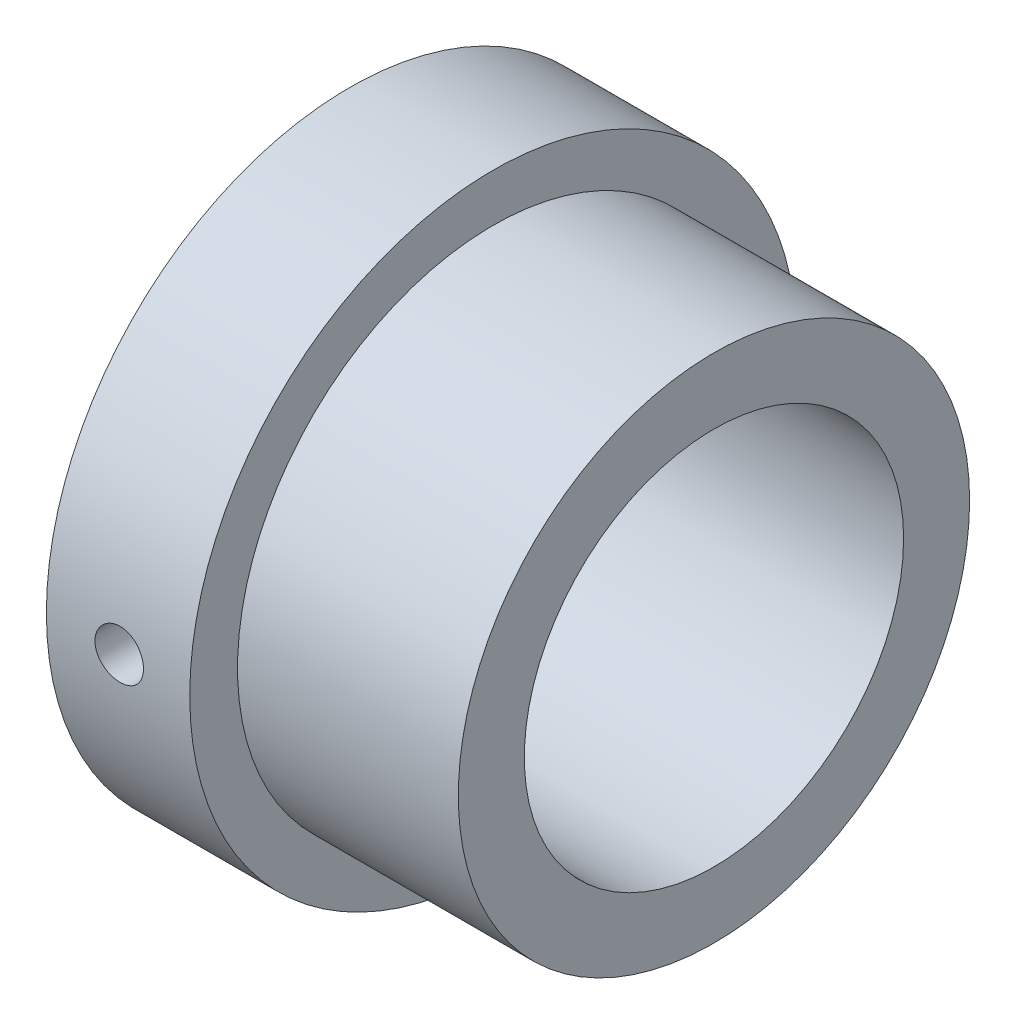
ISO-10303-21;
HEADER;
FILE_DESCRIPTION(('STEP AP214'),'2;1');
FILE_NAME('part.step','',(''),(''),'','','');
FILE_SCHEMA(('AUTOMOTIVE_DESIGN { 1 0 10303 214 1 1 1 1 }'));
ENDSEC;
DATA;
#1=APPLICATION_CONTEXT('core data for automotive mechanical design processes');
#2=APPLICATION_PROTOCOL_DEFINITION('international standard','automotive_design',2000,#1);
#3=PRODUCT_CONTEXT('',#1,'mechanical');
#4=PRODUCT('Part','Part','',(#3));
#5=PRODUCT_RELATED_PRODUCT_CATEGORY('part','',(#4));
#6=PRODUCT_DEFINITION_FORMATION('','',#4);
#7=PRODUCT_DEFINITION_CONTEXT('part definition',#1,'design');
#8=PRODUCT_DEFINITION('design','',#6,#7);
#9=PRODUCT_DEFINITION_SHAPE('','',#8);
#10=(LENGTH_UNIT() NAMED_UNIT(*) SI_UNIT(.MILLI.,.METRE.));
#11=(NAMED_UNIT(*) PLANE_ANGLE_UNIT() SI_UNIT($,.RADIAN.));
#12=(NAMED_UNIT(*) SI_UNIT($,.STERADIAN.) SOLID_ANGLE_UNIT());
#13=UNCERTAINTY_MEASURE_WITH_UNIT(LENGTH_MEASURE(1.E-05),#10,'distance_accuracy_value','');
#14=(GEOMETRIC_REPRESENTATION_CONTEXT(3) GLOBAL_UNCERTAINTY_ASSIGNED_CONTEXT((#13)) GLOBAL_UNIT_ASSIGNED_CONTEXT((#10,
#11,#12)) REPRESENTATION_CONTEXT('',''));
#15=CARTESIAN_POINT('',(0.,0.,0.));
#16=DIRECTION('',(0.,0.,1.));
#17=DIRECTION('',(1.,0.,0.));
#18=AXIS2_PLACEMENT_3D('',#15,#16,#17);
#19=CARTESIAN_POINT('',(7.62,0.,0.));
#20=DIRECTION('',(1.,0.,0.));
#21=DIRECTION('',(0.,0.,-1.));
#22=AXIS2_PLACEMENT_3D('',#19,#20,#21);
#23=PLANE('',#22);
#24=CARTESIAN_POINT('',(7.62,0.,0.));
#25=DIRECTION('',(1.,0.,0.));
#26=DIRECTION('',(0.,0.,-1.));
#27=AXIS2_PLACEMENT_3D('',#24,#25,#26);
#28=CIRCLE('',#27,5.35);
#29=CARTESIAN_POINT('',(7.62,0.,-5.35));
#30=VERTEX_POINT('',#29);
#31=EDGE_CURVE('E85',#30,#30,#28,.T.);
#32=ORIENTED_EDGE('',*,*,#31,.T.);
#33=EDGE_LOOP('',(#32));
#34=FACE_BOUND('',#33,.T.);
#35=CARTESIAN_POINT('',(7.62,0.,0.));
#36=DIRECTION('',(1.,0.,0.));
#37=DIRECTION('',(0.,0.,-1.));
#38=AXIS2_PLACEMENT_3D('',#35,#36,#37);
#39=CIRCLE('',#38,3.96875);
#40=CARTESIAN_POINT('',(7.62,0.,-3.96875));
#41=VERTEX_POINT('',#40);
#42=EDGE_CURVE('E45',#41,#41,#39,.T.);
#43=ORIENTED_EDGE('',*,*,#42,.F.);
#44=EDGE_LOOP('',(#43));
#45=FACE_BOUND('',#44,.T.);
#46=ADVANCED_FACE('F33',(#34,#45),#23,.T.);
#47=CARTESIAN_POINT('',(0.,0.,0.));
#48=DIRECTION('',(1.,0.,0.));
#49=DIRECTION('',(0.,0.,-1.));
#50=AXIS2_PLACEMENT_3D('',#47,#48,#49);
#51=PLANE('',#50);
#52=CARTESIAN_POINT('',(0.,0.,0.));
#53=DIRECTION('',(1.,0.,0.));
#54=DIRECTION('',(0.,0.,-1.));
#55=AXIS2_PLACEMENT_3D('',#52,#53,#54);
#56=CIRCLE('',#55,6.35);
#57=CARTESIAN_POINT('',(0.,0.,-6.35));
#58=VERTEX_POINT('',#57);
#59=EDGE_CURVE('E10',#58,#58,#56,.T.);
#60=ORIENTED_EDGE('',*,*,#59,.F.);
#61=EDGE_LOOP('',(#60));
#62=FACE_BOUND('',#61,.T.);
#63=CARTESIAN_POINT('',(0.,0.,0.));
#64=DIRECTION('',(1.,0.,0.));
#65=DIRECTION('',(0.,0.,-1.));
#66=AXIS2_PLACEMENT_3D('',#63,#64,#65);
#67=CIRCLE('',#66,3.96875);
#68=CARTESIAN_POINT('',(0.,0.,-3.96875));
#69=VERTEX_POINT('',#68);
#70=EDGE_CURVE('E50',#69,#69,#67,.T.);
#71=ORIENTED_EDGE('',*,*,#70,.T.);
#72=EDGE_LOOP('',(#71));
#73=FACE_BOUND('',#72,.T.);
#74=ADVANCED_FACE('F95',(#62,#73),#51,.F.);
#75=CARTESIAN_POINT('',(7.62,0.,0.));
#76=DIRECTION('',(-1.,0.,0.));
#77=DIRECTION('',(0.,0.,1.));
#78=AXIS2_PLACEMENT_3D('',#75,#76,#77);
#79=CYLINDRICAL_SURFACE('',#78,6.35);
#80=CARTESIAN_POINT('',(1.12712500000001,-5.08,3.81));
#81=CARTESIAN_POINT('',(1.12712032592319,-5.04634684909866,3.85487018515749));
#82=CARTESIAN_POINT('',(1.13136343831119,-5.01207718154323,3.89931785689789));
#83=CARTESIAN_POINT('',(1.14969403175325,-4.94337886802459,3.98604168161496));
#84=CARTESIAN_POINT('',(1.16375080097996,-4.90895105001098,4.02832416863232));
#85=CARTESIAN_POINT('',(1.19372127513974,-4.85911685512097,4.08804992129532));
#86=CARTESIAN_POINT('',(1.20504409330394,-4.84295199043916,4.1071774083276));
#87=CARTESIAN_POINT('',(1.23098510375895,-4.8115474668377,4.14392192703404));
#88=CARTESIAN_POINT('',(1.24559980330024,-4.79630684887098,4.16154053251141));
#89=CARTESIAN_POINT('',(1.27541690391095,-4.77010726184544,4.19152696805345));
#90=CARTESIAN_POINT('',(1.29000756077163,-4.75887844159555,4.20426259267265));
#91=CARTESIAN_POINT('',(1.32172078042983,-4.73801816822208,4.22775702219265));
#92=CARTESIAN_POINT('',(1.33883945618481,-4.72838431010965,4.2385188060725));
#93=CARTESIAN_POINT('',(1.37118590361964,-4.71339923296516,4.25516895872115));
#94=CARTESIAN_POINT('',(1.38590828997281,-4.70757380215922,4.26160812433166));
#95=CARTESIAN_POINT('',(1.4165823326276,-4.6975989268619,4.27260103276412));
#96=CARTESIAN_POINT('',(1.4325331114964,-4.69344829905265,4.27715610683226));
#97=CARTESIAN_POINT('',(1.46540920936454,-4.68711487598744,4.28409581848277));
#98=CARTESIAN_POINT('',(1.48234052465735,-4.68494594071165,4.28646517019348));
#99=CARTESIAN_POINT('',(1.51650530610043,-4.68282749409858,4.28877948470976));
#100=CARTESIAN_POINT('',(1.53373863622741,-4.68287700804049,4.28872551225208));
#101=CARTESIAN_POINT('',(1.56601341789554,-4.68505981803168,4.28634065673177));
#102=CARTESIAN_POINT('',(1.58108998483861,-4.68696667340175,4.28425719972526));
#103=CARTESIAN_POINT('',(1.6105820608903,-4.69239422572317,4.27831187295925));
#104=CARTESIAN_POINT('',(1.62499747625254,-4.69591515076418,4.27444975185034));
#105=CARTESIAN_POINT('',(1.65341535097051,-4.70451304617975,4.26498522586055));
#106=CARTESIAN_POINT('',(1.66738034914176,-4.70964486978532,4.25932136009711));
#107=CARTESIAN_POINT('',(1.69410410825858,-4.72113187367627,4.2465854119835));
#108=CARTESIAN_POINT('',(1.70686224725864,-4.7274876796648,4.23951260931697));
#109=CARTESIAN_POINT('',(1.73800469520088,-4.74505443899158,4.21985959110184));
#110=CARTESIAN_POINT('',(1.75546077837842,-4.7569704954988,4.20643524914505));
#111=CARTESIAN_POINT('',(1.78730706039485,-4.78234934788668,4.1775600360547));
#112=CARTESIAN_POINT('',(1.8016891186954,-4.79581610883137,4.16210395494051));
#113=CARTESIAN_POINT('',(1.83386803094403,-4.83042327480162,4.12195399363447));
#114=CARTESIAN_POINT('',(1.84997001674907,-4.8521339773038,4.0963980432419));
#115=CARTESIAN_POINT('',(1.87681954999505,-4.89642491066252,4.04335623119161));
#116=CARTESIAN_POINT('',(1.88755843841709,-4.91900648468573,4.01586732977028));
#117=CARTESIAN_POINT('',(1.90851459461137,-4.97535315667785,3.94603840129574));
#118=CARTESIAN_POINT('',(1.91595590954817,-5.00923353878392,3.9029583212348));
#119=CARTESIAN_POINT('',(1.92228048606214,-5.07616414048833,3.81551003537365));
#120=CARTESIAN_POINT('',(1.92114172533685,-5.10921200525084,3.77113880624145));
#121=CARTESIAN_POINT('',(1.9108557811773,-5.17483759178893,3.68059431593768));
#122=CARTESIAN_POINT('',(1.90143795479392,-5.20736123735994,3.63441102878698));
#123=CARTESIAN_POINT('',(1.88096706161467,-5.25427679333368,3.56592835796933));
#124=CARTESIAN_POINT('',(1.87310170639063,-5.26958326185938,3.54326444150221));
#125=CARTESIAN_POINT('',(1.85511781043351,-5.29948943473829,3.49837615844335));
#126=CARTESIAN_POINT('',(1.8450009445282,-5.31408965467067,3.47615147842842));
#127=CARTESIAN_POINT('',(1.82341396177299,-5.34101405960069,3.43462065617959));
#128=CARTESIAN_POINT('',(1.81218062584476,-5.35341979103054,3.41524503690931));
#129=CARTESIAN_POINT('',(1.78737974202516,-5.37738685286415,3.37738249362319));
#130=CARTESIAN_POINT('',(1.77380711885475,-5.3889462677523,3.35889761612026));
#131=CARTESIAN_POINT('',(1.74373750682604,-5.41102796197764,3.323209588857));
#132=CARTESIAN_POINT('',(1.72720342255291,-5.42153408573851,3.30602717404469));
#133=CARTESIAN_POINT('',(1.69079923690007,-5.44070314511039,3.27438332907258));
#134=CARTESIAN_POINT('',(1.67094830054715,-5.44937605586266,3.2599072255031));
#135=CARTESIAN_POINT('',(1.63851105049115,-5.46016464981087,3.24178238446788));
#136=CARTESIAN_POINT('',(1.62729475721879,-5.46338401067033,3.23635055457359));
#137=CARTESIAN_POINT('',(1.60402575031538,-5.46890651404748,3.22700955328425));
#138=CARTESIAN_POINT('',(1.59197382720425,-5.47121050899373,3.22309896531371));
#139=CARTESIAN_POINT('',(1.56712757477182,-5.47472558726575,3.21712486524563));
#140=CARTESIAN_POINT('',(1.55432724734885,-5.4759260069733,3.21507937673126));
#141=CARTESIAN_POINT('',(1.5285094123729,-5.4770591569387,3.21314868542828));
#142=CARTESIAN_POINT('',(1.51549204604868,-5.47699268169974,3.21326212871662));
#143=CARTESIAN_POINT('',(1.49114014453606,-5.47567977996794,3.21549872160614));
#144=CARTESIAN_POINT('',(1.47977695327594,-5.47456287488857,3.21740126623064));
#145=CARTESIAN_POINT('',(1.45754267745711,-5.47143262043116,3.22272160655564));
#146=CARTESIAN_POINT('',(1.44667192025402,-5.46941868409537,3.22614039437881));
#147=CARTESIAN_POINT('',(1.42120339431255,-5.46363658241185,3.23592630237673));
#148=CARTESIAN_POINT('',(1.40693803545366,-5.45948715814251,3.24292831794023));
#149=CARTESIAN_POINT('',(1.37986867185939,-5.45005745757993,3.25875117898912));
#150=CARTESIAN_POINT('',(1.36706836707919,-5.44477441094821,3.26757647820145));
#151=CARTESIAN_POINT('',(1.3351156340028,-5.42973568052177,3.29253608643099));
#152=CARTESIAN_POINT('',(1.3171344700988,-5.41927998937533,3.3097358539679));
#153=CARTESIAN_POINT('',(1.28429544461043,-5.39693203272376,3.34605542379219));
#154=CARTESIAN_POINT('',(1.26944673863642,-5.38503571176443,3.36518061952628));
#155=CARTESIAN_POINT('',(1.23164470434189,-5.3504169295162,3.42012566836973));
#156=CARTESIAN_POINT('',(1.21155547629497,-5.32656614235774,3.45719855276271));
#157=CARTESIAN_POINT('',(1.17802806930299,-5.27674732157676,3.53277595451947));
#158=CARTESIAN_POINT('',(1.16459460067314,-5.25077780361229,3.57128146510019));
#159=CARTESIAN_POINT('',(1.14522869132857,-5.20102935796527,3.64327132626619));
#160=CARTESIAN_POINT('',(1.13850152439266,-5.17746365331092,3.67669152911945));
#161=CARTESIAN_POINT('',(1.12944937753206,-5.12937798900246,3.74348470626722));
#162=CARTESIAN_POINT('',(1.1271284524057,-5.10485717156704,3.77685760884695));
#163=CARTESIAN_POINT('',(1.12712500000001,-5.08,3.81));
#164=B_SPLINE_CURVE_WITH_KNOTS('',3,(#80,#81,#82,#83,#84,#85,#86,#87,#88,#89,#90,#91,#92,#93,
#94,#95,#96,#97,#98,#99,#100,#101,#102,#103,#104,#105,#106,#107,#108,#109,#110,#111,#112,#113,
#114,#115,#116,#117,#118,#119,#120,#121,#122,#123,#124,#125,#126,#127,#128,#129,#130,#131,#132,
#133,#134,#135,#136,#137,#138,#139,#140,#141,#142,#143,#144,#145,#146,#147,#148,#149,#150,#151,
#152,#153,#154,#155,#156,#157,#158,#159,#160,#161,#162,#163),.UNSPECIFIED.,.T.,.F.,(4,2,2,2,2,2,
2,2,2,2,2,2,2,2,2,2,2,2,2,2,2,2,2,2,2,2,2,2,2,2,2,2,2,2,2,2,2,2,2,2,2,4),(0.,0.168144115490672,
0.33576436927369,0.418025852478113,0.500200462402294,0.567134005337229,0.633965683663647,
0.685044571722233,0.736087306965204,0.787484362283017,0.838858835480186,0.884664882817435,
0.930477405158934,0.978059572290563,1.02566612843795,1.10035507840567,1.17523943181666,
1.28621447690168,1.39736812273945,1.56239989623299,1.72785539738446,1.8989295634469,
1.98422494982439,2.06945709847982,2.14615878546823,2.22302902757255,2.30093972579744,
2.37841490250151,2.41690994461795,2.45536905397458,2.49419599521133,2.53299858785235,
2.56756789919012,2.60215986369781,2.65115246760251,2.70026619130657,2.78078143217837,
2.86152884030483,3.00606498940871,3.15070328190111,3.27478516388908,3.3989811756977),.UNSPECIFIED.);
#165=CARTESIAN_POINT('',(1.12712500000001,-5.08,3.81));
#166=VERTEX_POINT('',#165);
#167=EDGE_CURVE('E38',#166,#166,#164,.T.);
#168=ORIENTED_EDGE('',*,*,#167,.T.);
#169=EDGE_LOOP('',(#168));
#170=FACE_BOUND('',#169,.T.);
#171=CARTESIAN_POINT('',(1.12712500000001,-5.08,-3.81));
#172=CARTESIAN_POINT('',(1.1271195842585,-5.1179286228781,-3.75942537511306));
#173=CARTESIAN_POINT('',(1.13250409103175,-5.15512423770042,-3.70824147573034));
#174=CARTESIAN_POINT('',(1.14820383071113,-5.20897402377095,-3.63181399578893));
#175=CARTESIAN_POINT('',(1.15470822197592,-5.2266010593896,-3.60639464472963));
#176=CARTESIAN_POINT('',(1.1703488040308,-5.26110691817905,-3.55586626815952));
#177=CARTESIAN_POINT('',(1.17948305214651,-5.27798628307267,-3.5307570277969));
#178=CARTESIAN_POINT('',(1.20073883264642,-5.31109593948287,-3.48075763905059));
#179=CARTESIAN_POINT('',(1.21290383720191,-5.32731238977208,-3.4558766859727));
#180=CARTESIAN_POINT('',(1.24054560261961,-5.35856658273996,-3.40721231190263));
#181=CARTESIAN_POINT('',(1.25601992326788,-5.37360518283519,-3.3834280978246));
#182=CARTESIAN_POINT('',(1.28652719050759,-5.39843176368347,-3.34362659426799));
#183=CARTESIAN_POINT('',(1.3006797242416,-5.40858503897629,-3.32716759267754));
#184=CARTESIAN_POINT('',(1.33161608233167,-5.42760212980082,-3.29605274635392));
#185=CARTESIAN_POINT('',(1.34839373690994,-5.4364688771669,-3.28139281392346));
#186=CARTESIAN_POINT('',(1.37783170746029,-5.44917668841061,-3.26022429657146));
#187=CARTESIAN_POINT('',(1.38954101042004,-5.45362810355863,-3.2527682558689));
#188=CARTESIAN_POINT('',(1.41411687319645,-5.46157782472761,-3.23940237836571));
#189=CARTESIAN_POINT('',(1.42698171972526,-5.46507751179974,-3.23349030162144));
#190=CARTESIAN_POINT('',(1.45145054629096,-5.47035229358663,-3.22455706304876));
#191=CARTESIAN_POINT('',(1.46289363498528,-5.47232001273726,-3.2212143417191));
#192=CARTESIAN_POINT('',(1.4862690875144,-5.47525236865023,-3.21622761578261));
#193=CARTESIAN_POINT('',(1.49820096394029,-5.4762179805464,-3.21458195979968));
#194=CARTESIAN_POINT('',(1.52226091294278,-5.47705417650571,-3.21315707150163));
#195=CARTESIAN_POINT('',(1.5343895369803,-5.47692080803325,-3.21338457609598));
#196=CARTESIAN_POINT('',(1.55840658873044,-5.47556412562837,-3.21569574584875));
#197=CARTESIAN_POINT('',(1.57029485837307,-5.47434011684301,-3.21778059433102));
#198=CARTESIAN_POINT('',(1.59545239408986,-5.47063028513948,-3.22408428512686));
#199=CARTESIAN_POINT('',(1.608619282529,-5.46796739895888,-3.22860216347518));
#200=CARTESIAN_POINT('',(1.63392277866723,-5.46157301694856,-3.2394072905349));
#201=CARTESIAN_POINT('',(1.64605751635882,-5.45783963294749,-3.24569766527868));
#202=CARTESIAN_POINT('',(1.67519961574526,-5.44741881328706,-3.26316968412959));
#203=CARTESIAN_POINT('',(1.69150031726607,-5.44019995051898,-3.2752024612908));
#204=CARTESIAN_POINT('',(1.72180722025884,-5.42449109459366,-3.30115584051195));
#205=CARTESIAN_POINT('',(1.73580752003752,-5.41599793569941,-3.31508113580601));
#206=CARTESIAN_POINT('',(1.77192908234851,-5.39117631353219,-3.35538742610749));
#207=CARTESIAN_POINT('',(1.79193323321897,-5.37387744950303,-3.38305641193605));
#208=CARTESIAN_POINT('',(1.82707251366912,-5.33747677568105,-3.4402045937953));
#209=CARTESIAN_POINT('',(1.84219438958045,-5.3183702372756,-3.46968846283097));
#210=CARTESIAN_POINT('',(1.87603498658824,-5.26710874518572,-3.54729602349394));
#211=CARTESIAN_POINT('',(1.89158914909737,-5.2339214158973,-3.59612802835703));
#212=CARTESIAN_POINT('',(1.91329342640255,-5.16517651804108,-3.69419173012741));
#213=CARTESIAN_POINT('',(1.91943666391405,-5.12961723588888,-3.74342369292808));
#214=CARTESIAN_POINT('',(1.92167178385352,-5.06283097558426,-3.83312525502255));
#215=CARTESIAN_POINT('',(1.91922579762885,-5.03183096961326,-3.87372672069352));
#216=CARTESIAN_POINT('',(1.90650106600259,-4.96948698914664,-3.95338252837821));
#217=CARTESIAN_POINT('',(1.8962433765616,-4.93814416217194,-3.99244073296205));
#218=CARTESIAN_POINT('',(1.8721700005546,-4.88835626393919,-4.05306933226322));
#219=CARTESIAN_POINT('',(1.86126870723045,-4.8696150959945,-4.07555651023389));
#220=CARTESIAN_POINT('',(1.83545117069159,-4.83299930845482,-4.11890953300055));
#221=CARTESIAN_POINT('',(1.82053931415238,-4.8151237671143,-4.13977711733148));
#222=CARTESIAN_POINT('',(1.79047746174085,-4.78533365126196,-4.17414239191681));
#223=CARTESIAN_POINT('',(1.77631857426232,-4.77304589489371,-4.18817849787005));
#224=CARTESIAN_POINT('',(1.74526516455397,-4.74996312518997,-4.21433893495329));
#225=CARTESIAN_POINT('',(1.72837508881475,-4.7391657375588,-4.2264663112935));
#226=CARTESIAN_POINT('',(1.69622660558326,-4.72209631843603,-4.2455187911777));
#227=CARTESIAN_POINT('',(1.68154404053736,-4.71535958661013,-4.25299441441973));
#228=CARTESIAN_POINT('',(1.65073085233262,-4.70354200659492,-4.26606027359916));
#229=CARTESIAN_POINT('',(1.63460111504704,-4.69846015408911,-4.27165165312222));
#230=CARTESIAN_POINT('',(1.60107912182651,-4.6902972087901,-4.28061326306599));
#231=CARTESIAN_POINT('',(1.58367722114274,-4.68723365609759,-4.28396402499315));
#232=CARTESIAN_POINT('',(1.54832066207607,-4.68347335673707,-4.28807482822826));
#233=CARTESIAN_POINT('',(1.53036645904549,-4.68277471041327,-4.28883694891297));
#234=CARTESIAN_POINT('',(1.49701614877152,-4.68373965108024,-4.28778295253871));
#235=CARTESIAN_POINT('',(1.4815988295918,-4.68510003046944,-4.28629777594668));
#236=CARTESIAN_POINT('',(1.45132207989169,-4.68953644514209,-4.28144352215648));
#237=CARTESIAN_POINT('',(1.43646270165873,-4.69261264079707,-4.27807426885999));
#238=CARTESIAN_POINT('',(1.40754123831245,-4.70029891197969,-4.26962791105414));
#239=CARTESIAN_POINT('',(1.39348570871783,-4.70491993776329,-4.26453861138973));
#240=CARTESIAN_POINT('',(1.36649816612667,-4.71542759352167,-4.25291713490108));
#241=CARTESIAN_POINT('',(1.35356663992166,-4.72131476805224,-4.24638433721197));
#242=CARTESIAN_POINT('',(1.32243880733795,-4.7374632305677,-4.22837481549131));
#243=CARTESIAN_POINT('',(1.30504885025525,-4.7483969462473,-4.21610454154304));
#244=CARTESIAN_POINT('',(1.27310675040619,-4.77184895143681,-4.18954344419338));
#245=CARTESIAN_POINT('',(1.25856203999916,-4.7843712537809,-4.17524749276376));
#246=CARTESIAN_POINT('',(1.22593169884658,-4.81654373674278,-4.13814617694869));
#247=CARTESIAN_POINT('',(1.20938967094821,-4.8367801753415,-4.11449688914073));
#248=CARTESIAN_POINT('',(1.18131196121352,-4.87825025151903,-4.06524539479205));
#249=CARTESIAN_POINT('',(1.1697830632194,-4.89948519752622,-4.03964059673431));
#250=CARTESIAN_POINT('',(1.14882161775882,-4.94738132507754,-3.9809131480789));
#251=CARTESIAN_POINT('',(1.1405435322513,-4.974129581286,-3.9474531405471));
#252=CARTESIAN_POINT('',(1.12969292722552,-5.02736825062973,-3.87942626029956));
#253=CARTESIAN_POINT('',(1.12712873272346,-5.05385823163134,-3.84485784689245));
#254=CARTESIAN_POINT('',(1.12712500000001,-5.08,-3.81));
#255=B_SPLINE_CURVE_WITH_KNOTS('',3,(#171,#172,#173,#174,#175,#176,#177,#178,#179,#180,#181,
#182,#183,#184,#185,#186,#187,#188,#189,#190,#191,#192,#193,#194,#195,#196,#197,#198,#199,#200,
#201,#202,#203,#204,#205,#206,#207,#208,#209,#210,#211,#212,#213,#214,#215,#216,#217,#218,#219,
#220,#221,#222,#223,#224,#225,#226,#227,#228,#229,#230,#231,#232,#233,#234,#235,#236,#237,#238,
#239,#240,#241,#242,#243,#244,#245,#246,#247,#248,#249,#250,#251,#252,#253,#254),.UNSPECIFIED.,
.T.,.F.,(4,2,2,2,2,2,2,2,2,2,2,2,2,2,2,2,2,2,2,2,2,2,2,2,2,2,2,2,2,2,2,2,2,2,2,2,2,2,2,2,2,4),
(0.,0.189464590186691,0.284208789957122,0.378883181002441,0.475002767590541,0.5710517206811,
0.642779697440595,0.714341557616778,0.757955286392084,0.80150538549287,0.837604000038657,
0.873667454594124,0.909860669550656,0.946076959903914,0.988361625919296,1.03072133839348,
1.094883108306,1.15920699880905,1.27339103451279,1.38788248336846,1.57010657985382,
1.75246377804237,1.90539137835567,2.05790822443855,2.15138560553707,2.24476115581318,
2.31479788552637,2.38472171968505,2.43792254772974,2.49109102871657,2.54471568189316,
2.59829724981747,2.64471826764217,2.69114362500883,2.73790529561866,2.7846871182398,
2.856063724542,2.9276243616521,3.03278251129908,3.13808252299898,3.26847845935742,
3.39906425591117),.UNSPECIFIED.);
#256=CARTESIAN_POINT('',(1.12712500000001,-5.08,-3.81));
#257=VERTEX_POINT('',#256);
#258=EDGE_CURVE('E61',#257,#257,#255,.T.);
#259=ORIENTED_EDGE('',*,*,#258,.T.);
#260=EDGE_LOOP('',(#259));
#261=FACE_BOUND('',#260,.T.);
#262=CARTESIAN_POINT('',(2.032,0.,6.35));
#263=CARTESIAN_POINT('',(2.03199875406759,-0.0284857193049497,6.34999973306454));
#264=CARTESIAN_POINT('',(2.02959596905546,-0.0569909297890136,6.34980627761363));
#265=CARTESIAN_POINT('',(2.0200460034206,-0.113212953756505,6.34905314531252));
#266=CARTESIAN_POINT('',(2.01289342138383,-0.14092883215566,6.34849305153583));
#267=CARTESIAN_POINT('',(1.99405176982391,-0.194749765443451,6.34706994815829));
#268=CARTESIAN_POINT('',(1.98236523610747,-0.220855711313532,6.34620710790711));
#269=CARTESIAN_POINT('',(1.95479188209073,-0.270729092285768,6.34427532502263));
#270=CARTESIAN_POINT('',(1.93890597158563,-0.294497032388439,6.3432064270453));
#271=CARTESIAN_POINT('',(1.90334423382905,-0.339082176985212,6.34097968761358));
#272=CARTESIAN_POINT('',(1.88366054826759,-0.359893105071176,6.33982166478266));
#273=CARTESIAN_POINT('',(1.84107856389086,-0.397919651537022,6.33754871818422));
#274=CARTESIAN_POINT('',(1.81818012520061,-0.415135113395858,6.33643379629473));
#275=CARTESIAN_POINT('',(1.76978095221928,-0.44550304300868,6.3343713070339));
#276=CARTESIAN_POINT('',(1.74427677115283,-0.458650034119346,6.33342396597426));
#277=CARTESIAN_POINT('',(1.6914141276317,-0.480472836968702,6.33180592668721));
#278=CARTESIAN_POINT('',(1.6640556956297,-0.489148722117044,6.3311352239178));
#279=CARTESIAN_POINT('',(1.60832374346252,-0.501764932611031,6.33014789143902));
#280=CARTESIAN_POINT('',(1.57995254073477,-0.505715434693829,6.3298305009277));
#281=CARTESIAN_POINT('',(1.52294809723381,-0.508800173836419,6.32958331178566));
#282=CARTESIAN_POINT('',(1.49431486103699,-0.507934494850928,6.32965350639863));
#283=CARTESIAN_POINT('',(1.43766881199618,-0.501419861212218,6.33017286623199));
#284=CARTESIAN_POINT('',(1.40965471903602,-0.495781957877885,6.33062115586704));
#285=CARTESIAN_POINT('',(1.3549717427623,-0.479900079390112,6.33184481894731));
#286=CARTESIAN_POINT('',(1.32830287168489,-0.4696560623478,6.33262019536711));
#287=CARTESIAN_POINT('',(1.27703209951479,-0.444840341898172,6.33441167184783));
#288=CARTESIAN_POINT('',(1.25243261307382,-0.430263670413183,6.33542804798118));
#289=CARTESIAN_POINT('',(1.2060253034097,-0.397200003571505,6.33758674207351));
#290=CARTESIAN_POINT('',(1.184217532238,-0.378712935322625,6.33872906237996));
#291=CARTESIAN_POINT('',(1.14394843091019,-0.338291224851532,6.34101482430859));
#292=CARTESIAN_POINT('',(1.1254966910773,-0.316347026823728,6.34215826003943));
#293=CARTESIAN_POINT('',(1.09253754825359,-0.269667338287702,6.34431434523044));
#294=CARTESIAN_POINT('',(1.07803014763491,-0.244931846100804,6.34532699461195));
#295=CARTESIAN_POINT('',(1.05337213028115,-0.193365559634019,6.34710757815558));
#296=CARTESIAN_POINT('',(1.04322192728322,-0.166534566661897,6.3478754890768));
#297=CARTESIAN_POINT('',(1.02757309131933,-0.111541725627414,6.34907979854185));
#298=CARTESIAN_POINT('',(1.02207436938912,-0.0833799030293799,6.34951620342605));
#299=CARTESIAN_POINT('',(1.01589658289788,-0.0266079550879086,6.3500075151304));
#300=CARTESIAN_POINT('',(1.01520426932498,0.00200071984579187,6.35006347066203));
#301=CARTESIAN_POINT('',(1.01862426015079,0.0589273391655138,6.34979037777372));
#302=CARTESIAN_POINT('',(1.0227365232962,0.0872452860456936,6.3494613326595));
#303=CARTESIAN_POINT('',(1.03563795625938,0.142748910861868,6.34845592449252));
#304=CARTESIAN_POINT('',(1.0444209961331,0.169936022602307,6.34778001670416));
#305=CARTESIAN_POINT('',(1.0664084098151,0.222450620449516,6.34615683214426));
#306=CARTESIAN_POINT('',(1.07961284820498,0.247778079386495,6.3452095514089));
#307=CARTESIAN_POINT('',(1.1101016058156,0.295914780029602,6.34314724059117));
#308=CARTESIAN_POINT('',(1.1273947151026,0.318718438656433,6.34203185099799));
#309=CARTESIAN_POINT('',(1.16555721181266,0.361103896466336,6.33975988334265));
#310=CARTESIAN_POINT('',(1.18642665650487,0.380685644045942,6.33860330462116));
#311=CARTESIAN_POINT('',(1.23120685100791,0.416116771417105,6.33637621870337));
#312=CARTESIAN_POINT('',(1.25512444594654,0.431957514397432,6.33530591436532));
#313=CARTESIAN_POINT('',(1.30528787796037,0.459397778469857,6.33337538018158));
#314=CARTESIAN_POINT('',(1.33153369335507,0.470997339050883,6.33251514837997));
#315=CARTESIAN_POINT('',(1.38557778975726,0.489611213131012,6.33110326059578));
#316=CARTESIAN_POINT('',(1.41337423091961,0.496630840273304,6.33055124712568));
#317=CARTESIAN_POINT('',(1.46975579777505,0.505902896098149,6.32981707724986));
#318=CARTESIAN_POINT('',(1.49834090963316,0.508155408352447,6.32963491436035));
#319=CARTESIAN_POINT('',(1.55540255529158,0.50782836068627,6.32966115537756));
#320=CARTESIAN_POINT('',(1.58387916836576,0.505262372155452,6.32986846233658));
#321=CARTESIAN_POINT('',(1.63999565367312,0.495399432338358,6.33064795502181));
#322=CARTESIAN_POINT('',(1.66763552458013,0.488102473554294,6.3312201413263));
#323=CARTESIAN_POINT('',(1.72129500565929,0.468988103951374,6.33266463493847));
#324=CARTESIAN_POINT('',(1.74731469262434,0.45717090757104,6.333536928009));
#325=CARTESIAN_POINT('',(1.79700298490917,0.42935307008977,6.335483367119));
#326=CARTESIAN_POINT('',(1.82067163139257,0.413352502251983,6.33655750962339));
#327=CARTESIAN_POINT('',(1.86505537058267,0.377571183669624,6.33879020633748));
#328=CARTESIAN_POINT('',(1.8857623710401,0.357780408889134,6.3399489792274));
#329=CARTESIAN_POINT('',(1.92356871689363,0.314998139026027,6.34221838384599));
#330=CARTESIAN_POINT('',(1.94066718646146,0.292005869149354,6.3433290038356));
#331=CARTESIAN_POINT('',(1.97079213514998,0.243432272528466,6.34537881046931));
#332=CARTESIAN_POINT('',(1.98381144666882,0.217846491872762,6.34631769415973));
#333=CARTESIAN_POINT('',(2.00535274290087,0.164862237306823,6.34791461959161));
#334=CARTESIAN_POINT('',(2.01387991473935,0.137465895413467,6.34857298508189));
#335=CARTESIAN_POINT('',(2.02401516222195,0.09158902902717,6.34936504954435));
#336=CARTESIAN_POINT('',(2.02700551598922,0.073403831126643,6.34960207664132));
#337=CARTESIAN_POINT('',(2.03099833513117,0.0368151360341009,6.34991963794666));
#338=CARTESIAN_POINT('',(2.0320008053038,0.0184116393690799,6.35000017253275));
#339=CARTESIAN_POINT('',(2.032,0.,6.35));
#340=B_SPLINE_CURVE_WITH_KNOTS('',3,(#262,#263,#264,#265,#266,#267,#268,#269,#270,#271,#272,
#273,#274,#275,#276,#277,#278,#279,#280,#281,#282,#283,#284,#285,#286,#287,#288,#289,#290,#291,
#292,#293,#294,#295,#296,#297,#298,#299,#300,#301,#302,#303,#304,#305,#306,#307,#308,#309,#310,
#311,#312,#313,#314,#315,#316,#317,#318,#319,#320,#321,#322,#323,#324,#325,#326,#327,#328,#329,
#330,#331,#332,#333,#334,#335,#336,#337,#338,#339),.UNSPECIFIED.,.T.,.F.,(4,2,2,2,2,2,2,2,2,2,2,
2,2,2,2,2,2,2,2,2,2,2,2,2,2,2,2,2,2,2,2,2,2,2,2,2,2,2,4),(0.,0.0853899369780829,
0.170877145070279,0.256316609546171,0.341737578706346,0.427337233123012,0.512940613163868,
0.598658729214787,0.684375437842656,0.769907209908598,0.85543749100627,0.940770244808274,
1.02610377465822,1.11153553295622,1.19696888389491,1.2826426627841,1.36831649319753,
1.45399845696028,1.5396787819326,1.6251228323551,1.71056614913882,1.7958976055482,
1.88123030841439,1.96674815997967,2.05226738110112,2.13798215036407,2.22369612153107,
2.30931046959025,2.39492331674168,2.48029539544671,2.56566760945238,2.65103577393167,
2.73640244346323,2.82199808210229,2.90761447186854,2.99338046765522,3.0790472101739,
3.13423881348784,3.1894302835911),.UNSPECIFIED.);
#341=CARTESIAN_POINT('',(2.032,0.,6.35));
#342=VERTEX_POINT('',#341);
#343=EDGE_CURVE('E60',#342,#342,#340,.T.);
#344=ORIENTED_EDGE('',*,*,#343,.T.);
#345=EDGE_LOOP('',(#344));
#346=FACE_BOUND('',#345,.T.);
#347=CARTESIAN_POINT('',(3.,0.,0.));
#348=DIRECTION('',(1.,0.,0.));
#349=DIRECTION('',(0.,0.,-1.));
#350=AXIS2_PLACEMENT_3D('',#347,#348,#349);
#351=CIRCLE('',#350,6.35);
#352=CARTESIAN_POINT('',(3.,0.,-6.35));
#353=VERTEX_POINT('',#352);
#354=EDGE_CURVE('E82',#353,#353,#351,.T.);
#355=ORIENTED_EDGE('',*,*,#354,.F.);
#356=EDGE_LOOP('',(#355));
#357=FACE_BOUND('',#356,.T.);
#358=ORIENTED_EDGE('',*,*,#59,.T.);
#359=EDGE_LOOP('',(#358));
#360=FACE_BOUND('',#359,.T.);
#361=ADVANCED_FACE('F35',(#170,#261,#346,#357,#360),#79,.T.);
#362=CARTESIAN_POINT('',(7.62,0.,0.));
#363=DIRECTION('',(-1.,0.,0.));
#364=DIRECTION('',(0.,0.,1.));
#365=AXIS2_PLACEMENT_3D('',#362,#363,#364);
#366=CYLINDRICAL_SURFACE('',#365,3.96875);
#367=CARTESIAN_POINT('',(2.032,0.,3.96875));
#368=CARTESIAN_POINT('',(2.0319987965729,-0.0284099725746659,3.96874959593062));
#369=CARTESIAN_POINT('',(2.02960871566066,-0.0568375583069171,3.96844172528445));
#370=CARTESIAN_POINT('',(2.02011216580898,-0.112901294587694,3.96724318380275));
#371=CARTESIAN_POINT('',(2.01300080893,-0.140536593917216,3.96635190898202));
#372=CARTESIAN_POINT('',(1.99427499503581,-0.19419603472603,3.96408693873784));
#373=CARTESIAN_POINT('',(1.98266361058561,-0.220221261513674,3.96271357254077));
#374=CARTESIAN_POINT('',(1.9552741570363,-0.269948882133552,3.95963705590257));
#375=CARTESIAN_POINT('',(1.93949678751763,-0.293651665050868,3.95793396084454));
#376=CARTESIAN_POINT('',(1.90412608699077,-0.338202956154771,3.95437708014517));
#377=CARTESIAN_POINT('',(1.88451354344428,-0.359036154154283,3.95252256439063));
#378=CARTESIAN_POINT('',(1.84207048756208,-0.397125014425581,3.94887772530407));
#379=CARTESIAN_POINT('',(1.81923980910739,-0.414380491903015,3.9470874052918));
#380=CARTESIAN_POINT('',(1.7709086748647,-0.444881418714418,3.943766491986));
#381=CARTESIAN_POINT('',(1.74539906219947,-0.458112469538347,3.94223683968859));
#382=CARTESIAN_POINT('',(1.69249705963676,-0.480097002905649,3.93962012658725));
#383=CARTESIAN_POINT('',(1.66510474458846,-0.488850663336593,3.93853304820011));
#384=CARTESIAN_POINT('',(1.60937406413186,-0.50158528811068,3.93693156492647));
#385=CARTESIAN_POINT('',(1.58104170670806,-0.505592147803882,3.93641405397278));
#386=CARTESIAN_POINT('',(1.52410234011252,-0.508799570379183,3.93600080386355));
#387=CARTESIAN_POINT('',(1.49549534255512,-0.508000335621753,3.93610503852942));
#388=CARTESIAN_POINT('',(1.43899948296503,-0.501639503004218,3.93692066004036));
#389=CARTESIAN_POINT('',(1.41110734538329,-0.496106464687362,3.93762840575421));
#390=CARTESIAN_POINT('',(1.35665073440862,-0.480479663700859,3.93956562417069));
#391=CARTESIAN_POINT('',(1.33008628912104,-0.470385804530506,3.94079510791256));
#392=CARTESIAN_POINT('',(1.27895060951206,-0.445893302802296,3.94364138712551));
#393=CARTESIAN_POINT('',(1.25438536724282,-0.431482284334456,3.94525929339488));
#394=CARTESIAN_POINT('',(1.20801108327513,-0.398773388842085,3.94869926791681));
#395=CARTESIAN_POINT('',(1.1862021738142,-0.380475325445941,3.95052134595679));
#396=CARTESIAN_POINT('',(1.14579388862832,-0.340353643899153,3.95418053673595));
#397=CARTESIAN_POINT('',(1.12721894088308,-0.318505415683286,3.95601766266325));
#398=CARTESIAN_POINT('',(1.09399617312061,-0.271988235669663,3.95948759588115));
#399=CARTESIAN_POINT('',(1.0793483629245,-0.247319276817955,3.9611204026608));
#400=CARTESIAN_POINT('',(1.05439551322862,-0.195841800078177,3.96399880839458));
#401=CARTESIAN_POINT('',(1.04409204253115,-0.169032513436918,3.96524426742945));
#402=CARTESIAN_POINT('',(1.02813994524579,-0.114044837001731,3.96720639197229));
#403=CARTESIAN_POINT('',(1.02249109008349,-0.085866514509077,3.96792308344628));
#404=CARTESIAN_POINT('',(1.01604032554676,-0.0291518186234685,3.96874353891328));
#405=CARTESIAN_POINT('',(1.0152047729409,-0.000619330968073252,3.96885155719393));
#406=CARTESIAN_POINT('',(1.01831548987581,0.0561788742151345,3.96845399237114));
#407=CARTESIAN_POINT('',(1.02226165251882,0.0844445976923647,3.96794842298477));
#408=CARTESIAN_POINT('',(1.03479583039118,0.139807352168611,3.96638313793633));
#409=CARTESIAN_POINT('',(1.04336776536234,0.166908082664196,3.96532534235339));
#410=CARTESIAN_POINT('',(1.06489341753071,0.219287406211164,3.96277400708603));
#411=CARTESIAN_POINT('',(1.07784729005842,0.24456593463076,3.9612804519551));
#412=CARTESIAN_POINT('',(1.10785022811625,0.292733286655895,3.95801344475));
#413=CARTESIAN_POINT('',(1.12492100967499,0.315608482384309,3.95623852613674));
#414=CARTESIAN_POINT('',(1.16264252117212,0.358181081491204,3.95261182483612));
#415=CARTESIAN_POINT('',(1.18329340038724,0.377878352295911,3.95076003894613));
#416=CARTESIAN_POINT('',(1.22773728013385,0.413655673648245,3.94717514426937));
#417=CARTESIAN_POINT('',(1.2515483279567,0.429713394306411,3.94544281119234));
#418=CARTESIAN_POINT('',(1.30154924958907,0.457601427079539,3.94230583202727));
#419=CARTESIAN_POINT('',(1.32773907375746,0.469431827386277,3.94090117910327));
#420=CARTESIAN_POINT('',(1.38168267215337,0.488493416141465,3.93858392304324));
#421=CARTESIAN_POINT('',(1.40943197073759,0.495737101139734,3.93766998399595));
#422=CARTESIAN_POINT('',(1.46576554218358,0.505459832768857,3.93643383492967));
#423=CARTESIAN_POINT('',(1.49434977408848,0.507939112716006,3.93611159593474));
#424=CARTESIAN_POINT('',(1.55131961660231,0.508058235100197,3.93609620367744));
#425=CARTESIAN_POINT('',(1.57970515899035,0.505733161018345,3.93639848985833));
#426=CARTESIAN_POINT('',(1.63567841716412,0.496383967082896,3.93758827117623));
#427=CARTESIAN_POINT('',(1.66326613299538,0.489359847497419,3.93847576627984));
#428=CARTESIAN_POINT('',(1.71685543670293,0.470823084563409,3.9407345359969));
#429=CARTESIAN_POINT('',(1.74285764733221,0.459312216819919,3.94210561921272));
#430=CARTESIAN_POINT('',(1.79256714271531,0.432132158365154,3.94517738427478));
#431=CARTESIAN_POINT('',(1.81627439319821,0.416462905569274,3.94687807104189));
#432=CARTESIAN_POINT('',(1.86090023879117,0.381280989387369,3.95043228952006));
#433=CARTESIAN_POINT('',(1.88179815386455,0.361742192482777,3.95228680772086));
#434=CARTESIAN_POINT('',(1.92003192906405,0.319430477308504,3.95593107265456));
#435=CARTESIAN_POINT('',(1.93736694971849,0.296656798984584,3.95772080404106));
#436=CARTESIAN_POINT('',(1.96804205035895,0.248417344241211,3.96104175294742));
#437=CARTESIAN_POINT('',(1.98136594097982,0.222941204959323,3.96257191224815));
#438=CARTESIAN_POINT('',(2.00352722111783,0.170107399731359,3.96519063785072));
#439=CARTESIAN_POINT('',(2.01236946053828,0.142751804248657,3.9662796812569));
#440=CARTESIAN_POINT('',(2.02321202742117,0.0960472268446583,3.96763247416668));
#441=CARTESIAN_POINT('',(2.02650274820543,0.0769921291812332,3.9680494926038));
#442=CARTESIAN_POINT('',(2.03089713503181,0.0386274008332202,3.9686083918141));
#443=CARTESIAN_POINT('',(2.03200081828767,0.019317772153202,3.96875027475282));
#444=CARTESIAN_POINT('',(2.032,0.,3.96875));
#445=B_SPLINE_CURVE_WITH_KNOTS('',3,(#367,#368,#369,#370,#371,#372,#373,#374,#375,#376,#377,
#378,#379,#380,#381,#382,#383,#384,#385,#386,#387,#388,#389,#390,#391,#392,#393,#394,#395,#396,
#397,#398,#399,#400,#401,#402,#403,#404,#405,#406,#407,#408,#409,#410,#411,#412,#413,#414,#415,
#416,#417,#418,#419,#420,#421,#422,#423,#424,#425,#426,#427,#428,#429,#430,#431,#432,#433,#434,
#435,#436,#437,#438,#439,#440,#441,#442,#443,#444),.UNSPECIFIED.,.T.,.F.,(4,2,2,2,2,2,2,2,2,2,2,
2,2,2,2,2,2,2,2,2,2,2,2,2,2,2,2,2,2,2,2,2,2,2,2,2,2,2,4),(0.,0.0851593530358785,
0.170407009368523,0.255596561877737,0.340771817868245,0.426385232002425,0.512003067090182,
0.597923715223596,0.683840949448106,0.769287286474036,0.85473002580957,0.939660885935516,
1.02459354316598,1.10977204361582,1.19495462902981,1.28075509088972,1.36655576732011,
1.45238740110406,1.53821481969892,1.62344160108689,1.70866647722036,1.79359698259474,
1.87853049889314,1.96392222073516,2.04931750395056,2.13522332971988,2.22112736318834,
2.30679633167922,2.39246110479303,2.47750252774112,2.56254394583689,2.64755174338909,
2.7325608101774,2.81816488033245,2.90378909703437,2.98975440696394,3.07562648821642,
3.13353227896208,3.19143761394041),.UNSPECIFIED.);
#446=CARTESIAN_POINT('',(2.032,0.,3.96875));
#447=VERTEX_POINT('',#446);
#448=EDGE_CURVE('E54',#447,#447,#445,.T.);
#449=ORIENTED_EDGE('',*,*,#448,.F.);
#450=EDGE_LOOP('',(#449));
#451=FACE_BOUND('',#450,.T.);
#452=ORIENTED_EDGE('',*,*,#42,.T.);
#453=EDGE_LOOP('',(#452));
#454=FACE_BOUND('',#453,.T.);
#455=ORIENTED_EDGE('',*,*,#70,.F.);
#456=EDGE_LOOP('',(#455));
#457=FACE_BOUND('',#456,.T.);
#458=ADVANCED_FACE('F64',(#451,#454,#457),#366,.F.);
#459=CARTESIAN_POINT('',(3.,6.35,0.));
#460=DIRECTION('',(-1.,0.,0.));
#461=DIRECTION('',(0.,0.,1.));
#462=AXIS2_PLACEMENT_3D('',#459,#460,#461);
#463=PLANE('',#462);
#464=CARTESIAN_POINT('',(3.,0.,0.));
#465=DIRECTION('',(1.,0.,0.));
#466=DIRECTION('',(0.,0.,-1.));
#467=AXIS2_PLACEMENT_3D('',#464,#465,#466);
#468=CIRCLE('',#467,5.35);
#469=CARTESIAN_POINT('',(3.,0.,-5.35));
#470=VERTEX_POINT('',#469);
#471=EDGE_CURVE('E88',#470,#470,#468,.T.);
#472=ORIENTED_EDGE('',*,*,#471,.F.);
#473=EDGE_LOOP('',(#472));
#474=FACE_BOUND('',#473,.T.);
#475=ORIENTED_EDGE('',*,*,#354,.T.);
#476=EDGE_LOOP('',(#475));
#477=FACE_BOUND('',#476,.T.);
#478=ADVANCED_FACE('F98',(#474,#477),#463,.F.);
#479=CARTESIAN_POINT('',(7.62,0.,0.));
#480=DIRECTION('',(1.,0.,0.));
#481=DIRECTION('',(0.,0.,-1.));
#482=AXIS2_PLACEMENT_3D('',#479,#480,#481);
#483=CYLINDRICAL_SURFACE('',#482,5.35);
#484=ORIENTED_EDGE('',*,*,#31,.F.);
#485=EDGE_LOOP('',(#484));
#486=FACE_BOUND('',#485,.T.);
#487=ORIENTED_EDGE('',*,*,#471,.T.);
#488=EDGE_LOOP('',(#487));
#489=FACE_BOUND('',#488,.T.);
#490=ADVANCED_FACE('F73',(#486,#489),#483,.T.);
#491=CARTESIAN_POINT('',(1.524,0.,0.));
#492=DIRECTION('',(0.,0.,-1.));
#493=DIRECTION('',(-1.,0.,0.));
#494=AXIS2_PLACEMENT_3D('',#491,#492,#493);
#495=CYLINDRICAL_SURFACE('',#494,0.507999999999995);
#496=ORIENTED_EDGE('',*,*,#448,.T.);
#497=EDGE_LOOP('',(#496));
#498=FACE_BOUND('',#497,.T.);
#499=ORIENTED_EDGE('',*,*,#343,.F.);
#500=EDGE_LOOP('',(#499));
#501=FACE_BOUND('',#500,.T.);
#502=ADVANCED_FACE('F68',(#498,#501),#495,.F.);
#503=CARTESIAN_POINT('',(1.524,-5.08,-5.08));
#504=DIRECTION('',(0.,0.,-1.));
#505=DIRECTION('',(-1.,0.,0.));
#506=AXIS2_PLACEMENT_3D('',#503,#504,#505);
#507=CYLINDRICAL_SURFACE('',#506,0.396874999999989);
#508=ORIENTED_EDGE('',*,*,#258,.F.);
#509=EDGE_LOOP('',(#508));
#510=FACE_BOUND('',#509,.T.);
#511=ORIENTED_EDGE('',*,*,#167,.F.);
#512=EDGE_LOOP('',(#511));
#513=FACE_BOUND('',#512,.T.);
#514=ADVANCED_FACE('F72',(#510,#513),#507,.F.);
#515=CLOSED_SHELL('',(#46,#74,#361,#458,#478,#490,#502,#514));
#516=MANIFOLD_SOLID_BREP('B2',#515);
#517=ADVANCED_BREP_SHAPE_REPRESENTATION('',(#18,#516),#14);
#518=SHAPE_DEFINITION_REPRESENTATION(#9,#517);
ENDSEC;
END-ISO-10303-21;
